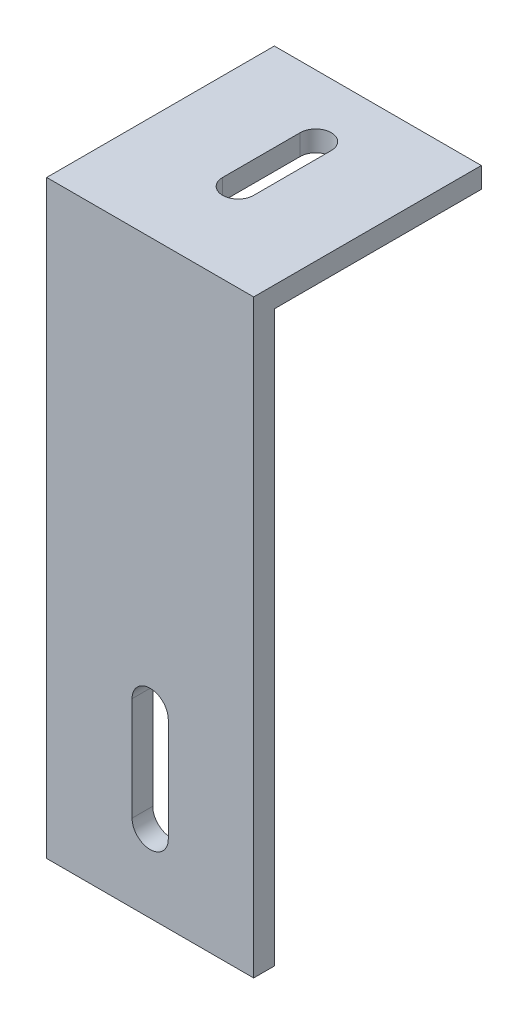
ISO-10303-21;
HEADER;
FILE_DESCRIPTION(('STEP AP214'),'2;1');
FILE_NAME('part.step','',(''),(''),'','','');
FILE_SCHEMA(('AUTOMOTIVE_DESIGN { 1 0 10303 214 1 1 1 1 }'));
ENDSEC;
DATA;
#1=APPLICATION_CONTEXT('core data for automotive mechanical design processes');
#2=APPLICATION_PROTOCOL_DEFINITION('international standard','automotive_design',2000,#1);
#3=PRODUCT_CONTEXT('',#1,'mechanical');
#4=PRODUCT('Part','Part','',(#3));
#5=PRODUCT_RELATED_PRODUCT_CATEGORY('part','',(#4));
#6=PRODUCT_DEFINITION_FORMATION('','',#4);
#7=PRODUCT_DEFINITION_CONTEXT('part definition',#1,'design');
#8=PRODUCT_DEFINITION('design','',#6,#7);
#9=PRODUCT_DEFINITION_SHAPE('','',#8);
#10=(LENGTH_UNIT() NAMED_UNIT(*) SI_UNIT(.MILLI.,.METRE.));
#11=(NAMED_UNIT(*) PLANE_ANGLE_UNIT() SI_UNIT($,.RADIAN.));
#12=(NAMED_UNIT(*) SI_UNIT($,.STERADIAN.) SOLID_ANGLE_UNIT());
#13=UNCERTAINTY_MEASURE_WITH_UNIT(LENGTH_MEASURE(1.E-05),#10,'distance_accuracy_value','');
#14=(GEOMETRIC_REPRESENTATION_CONTEXT(3) GLOBAL_UNCERTAINTY_ASSIGNED_CONTEXT((#13)) GLOBAL_UNIT_ASSIGNED_CONTEXT((#10,
#11,#12)) REPRESENTATION_CONTEXT('',''));
#15=CARTESIAN_POINT('',(0.,0.,0.));
#16=DIRECTION('',(0.,0.,1.));
#17=DIRECTION('',(1.,0.,0.));
#18=AXIS2_PLACEMENT_3D('',#15,#16,#17);
#19=CARTESIAN_POINT('',(40.,0.,-4.00000000000001));
#20=DIRECTION('',(0.,1.,0.));
#21=DIRECTION('',(0.,0.,1.));
#22=AXIS2_PLACEMENT_3D('',#19,#20,#21);
#23=PLANE('',#22);
#24=DIRECTION('',(0.,0.,-1.));
#25=VECTOR('',#24,1.);
#26=CARTESIAN_POINT('',(0.,0.,-4.00000000000001));
#27=LINE('',#26,#25);
#28=CARTESIAN_POINT('',(0.,0.,0.));
#29=VERTEX_POINT('',#28);
#30=CARTESIAN_POINT('',(0.,0.,-4.00000000000001));
#31=VERTEX_POINT('',#30);
#32=EDGE_CURVE('E234',#29,#31,#27,.T.);
#33=ORIENTED_EDGE('',*,*,#32,.T.);
#34=DIRECTION('',(-1.,0.,0.));
#35=VECTOR('',#34,1.);
#36=CARTESIAN_POINT('',(40.,0.,-4.00000000000001));
#37=LINE('',#36,#35);
#38=CARTESIAN_POINT('',(40.,0.,-4.00000000000001));
#39=VERTEX_POINT('',#38);
#40=EDGE_CURVE('E11',#39,#31,#37,.T.);
#41=ORIENTED_EDGE('',*,*,#40,.F.);
#42=DIRECTION('',(0.,0.,-1.));
#43=VECTOR('',#42,1.);
#44=CARTESIAN_POINT('',(40.,0.,-4.00000000000001));
#45=LINE('',#44,#43);
#46=CARTESIAN_POINT('',(40.,0.,0.));
#47=VERTEX_POINT('',#46);
#48=EDGE_CURVE('E235',#47,#39,#45,.T.);
#49=ORIENTED_EDGE('',*,*,#48,.F.);
#50=DIRECTION('',(-1.,0.,0.));
#51=VECTOR('',#50,1.);
#52=CARTESIAN_POINT('',(40.,0.,0.));
#53=LINE('',#52,#51);
#54=EDGE_CURVE('E255',#47,#29,#53,.T.);
#55=ORIENTED_EDGE('',*,*,#54,.T.);
#56=EDGE_LOOP('',(#33,#41,#49,#55));
#57=FACE_BOUND('',#56,.T.);
#58=ADVANCED_FACE('F43',(#57),#23,.F.);
#59=CARTESIAN_POINT('',(40.,110.,-4.));
#60=DIRECTION('',(0.,0.,1.));
#61=DIRECTION('',(0.,-1.,0.));
#62=AXIS2_PLACEMENT_3D('',#59,#60,#61);
#63=PLANE('',#62);
#64=DIRECTION('',(0.,1.,0.));
#65=VECTOR('',#64,1.);
#66=CARTESIAN_POINT('',(16.5,35.,-4.));
#67=LINE('',#66,#65);
#68=CARTESIAN_POINT('',(16.5,15.,-4.));
#69=VERTEX_POINT('',#68);
#70=CARTESIAN_POINT('',(16.5,35.,-4.));
#71=VERTEX_POINT('',#70);
#72=EDGE_CURVE('E166',#69,#71,#67,.T.);
#73=ORIENTED_EDGE('',*,*,#72,.F.);
#74=CARTESIAN_POINT('',(20.,15.,-4.00000000000001));
#75=DIRECTION('',(0.,0.,1.));
#76=DIRECTION('',(0.,-1.,0.));
#77=AXIS2_PLACEMENT_3D('',#74,#75,#76);
#78=CIRCLE('',#77,3.5);
#79=CARTESIAN_POINT('',(23.5,15.,-4.00000000000001));
#80=VERTEX_POINT('',#79);
#81=EDGE_CURVE('E146',#80,#69,#78,.F.);
#82=ORIENTED_EDGE('',*,*,#81,.F.);
#83=DIRECTION('',(0.,-1.,0.));
#84=VECTOR('',#83,1.);
#85=CARTESIAN_POINT('',(23.5,15.,-4.00000000000001));
#86=LINE('',#85,#84);
#87=CARTESIAN_POINT('',(23.5,35.,-4.));
#88=VERTEX_POINT('',#87);
#89=EDGE_CURVE('E156',#88,#80,#86,.T.);
#90=ORIENTED_EDGE('',*,*,#89,.F.);
#91=CARTESIAN_POINT('',(20.,35.,-4.));
#92=DIRECTION('',(0.,0.,1.));
#93=DIRECTION('',(0.,-1.,0.));
#94=AXIS2_PLACEMENT_3D('',#91,#92,#93);
#95=CIRCLE('',#94,3.5);
#96=EDGE_CURVE('E58',#71,#88,#95,.F.);
#97=ORIENTED_EDGE('',*,*,#96,.F.);
#98=EDGE_LOOP('',(#73,#82,#90,#97));
#99=FACE_BOUND('',#98,.T.);
#100=DIRECTION('',(0.,1.,0.));
#101=VECTOR('',#100,1.);
#102=CARTESIAN_POINT('',(0.,110.,-4.));
#103=LINE('',#102,#101);
#104=CARTESIAN_POINT('',(0.,110.,-4.));
#105=VERTEX_POINT('',#104);
#106=EDGE_CURVE('E259',#31,#105,#103,.T.);
#107=ORIENTED_EDGE('',*,*,#106,.T.);
#108=DIRECTION('',(-1.,0.,0.));
#109=VECTOR('',#108,1.);
#110=CARTESIAN_POINT('',(40.,110.,-4.));
#111=LINE('',#110,#109);
#112=CARTESIAN_POINT('',(40.,110.,-4.));
#113=VERTEX_POINT('',#112);
#114=EDGE_CURVE('E51',#113,#105,#111,.T.);
#115=ORIENTED_EDGE('',*,*,#114,.F.);
#116=DIRECTION('',(0.,1.,0.));
#117=VECTOR('',#116,1.);
#118=CARTESIAN_POINT('',(40.,110.,-4.));
#119=LINE('',#118,#117);
#120=EDGE_CURVE('E239',#39,#113,#119,.T.);
#121=ORIENTED_EDGE('',*,*,#120,.F.);
#122=ORIENTED_EDGE('',*,*,#40,.T.);
#123=EDGE_LOOP('',(#107,#115,#121,#122));
#124=FACE_BOUND('',#123,.T.);
#125=ADVANCED_FACE('F163',(#99,#124),#63,.F.);
#126=CARTESIAN_POINT('',(40.,110.,-44.));
#127=DIRECTION('',(0.,1.,0.));
#128=DIRECTION('',(0.,0.,1.));
#129=AXIS2_PLACEMENT_3D('',#126,#127,#128);
#130=PLANE('',#129);
#131=DIRECTION('',(0.,0.,1.));
#132=VECTOR('',#131,1.);
#133=CARTESIAN_POINT('',(23.,110.,-17.));
#134=LINE('',#133,#132);
#135=CARTESIAN_POINT('',(23.,110.,-32.));
#136=VERTEX_POINT('',#135);
#137=CARTESIAN_POINT('',(23.,110.,-17.));
#138=VERTEX_POINT('',#137);
#139=EDGE_CURVE('E194',#136,#138,#134,.T.);
#140=ORIENTED_EDGE('',*,*,#139,.F.);
#141=CARTESIAN_POINT('',(20.,110.,-32.));
#142=DIRECTION('',(0.,1.,0.));
#143=DIRECTION('',(0.,0.,1.));
#144=AXIS2_PLACEMENT_3D('',#141,#142,#143);
#145=CIRCLE('',#144,3.);
#146=CARTESIAN_POINT('',(17.,110.,-32.));
#147=VERTEX_POINT('',#146);
#148=EDGE_CURVE('E198',#147,#136,#145,.F.);
#149=ORIENTED_EDGE('',*,*,#148,.F.);
#150=DIRECTION('',(0.,0.,-1.));
#151=VECTOR('',#150,1.);
#152=CARTESIAN_POINT('',(17.,110.,-32.));
#153=LINE('',#152,#151);
#154=CARTESIAN_POINT('',(17.,110.,-17.));
#155=VERTEX_POINT('',#154);
#156=EDGE_CURVE('E221',#155,#147,#153,.T.);
#157=ORIENTED_EDGE('',*,*,#156,.F.);
#158=CARTESIAN_POINT('',(20.,110.,-17.));
#159=DIRECTION('',(0.,1.,0.));
#160=DIRECTION('',(0.,0.,1.));
#161=AXIS2_PLACEMENT_3D('',#158,#159,#160);
#162=CIRCLE('',#161,3.);
#163=EDGE_CURVE('E160',#138,#155,#162,.F.);
#164=ORIENTED_EDGE('',*,*,#163,.F.);
#165=EDGE_LOOP('',(#140,#149,#157,#164));
#166=FACE_BOUND('',#165,.T.);
#167=DIRECTION('',(0.,0.,-1.));
#168=VECTOR('',#167,1.);
#169=CARTESIAN_POINT('',(0.,110.,-44.));
#170=LINE('',#169,#168);
#171=CARTESIAN_POINT('',(0.,110.,-44.));
#172=VERTEX_POINT('',#171);
#173=EDGE_CURVE('E262',#105,#172,#170,.T.);
#174=ORIENTED_EDGE('',*,*,#173,.T.);
#175=DIRECTION('',(-1.,0.,0.));
#176=VECTOR('',#175,1.);
#177=CARTESIAN_POINT('',(40.,110.,-44.));
#178=LINE('',#177,#176);
#179=CARTESIAN_POINT('',(40.,110.,-44.));
#180=VERTEX_POINT('',#179);
#181=EDGE_CURVE('E284',#180,#172,#178,.T.);
#182=ORIENTED_EDGE('',*,*,#181,.F.);
#183=DIRECTION('',(0.,0.,-1.));
#184=VECTOR('',#183,1.);
#185=CARTESIAN_POINT('',(40.,110.,-44.));
#186=LINE('',#185,#184);
#187=EDGE_CURVE('E243',#113,#180,#186,.T.);
#188=ORIENTED_EDGE('',*,*,#187,.F.);
#189=ORIENTED_EDGE('',*,*,#114,.T.);
#190=EDGE_LOOP('',(#174,#182,#188,#189));
#191=FACE_BOUND('',#190,.T.);
#192=ADVANCED_FACE('F293',(#166,#191),#130,.F.);
#193=CARTESIAN_POINT('',(40.,114.,-44.));
#194=DIRECTION('',(0.,0.,1.));
#195=DIRECTION('',(0.,-1.,0.));
#196=AXIS2_PLACEMENT_3D('',#193,#194,#195);
#197=PLANE('',#196);
#198=DIRECTION('',(0.,1.,0.));
#199=VECTOR('',#198,1.);
#200=CARTESIAN_POINT('',(0.,114.,-44.));
#201=LINE('',#200,#199);
#202=CARTESIAN_POINT('',(0.,114.,-44.));
#203=VERTEX_POINT('',#202);
#204=EDGE_CURVE('E265',#172,#203,#201,.T.);
#205=ORIENTED_EDGE('',*,*,#204,.T.);
#206=DIRECTION('',(-1.,0.,0.));
#207=VECTOR('',#206,1.);
#208=CARTESIAN_POINT('',(40.,114.,-44.));
#209=LINE('',#208,#207);
#210=CARTESIAN_POINT('',(40.,114.,-44.));
#211=VERTEX_POINT('',#210);
#212=EDGE_CURVE('E280',#211,#203,#209,.T.);
#213=ORIENTED_EDGE('',*,*,#212,.F.);
#214=DIRECTION('',(0.,1.,0.));
#215=VECTOR('',#214,1.);
#216=CARTESIAN_POINT('',(40.,114.,-44.));
#217=LINE('',#216,#215);
#218=EDGE_CURVE('E246',#180,#211,#217,.T.);
#219=ORIENTED_EDGE('',*,*,#218,.F.);
#220=ORIENTED_EDGE('',*,*,#181,.T.);
#221=EDGE_LOOP('',(#205,#213,#219,#220));
#222=FACE_BOUND('',#221,.T.);
#223=ADVANCED_FACE('F303',(#222),#197,.F.);
#224=CARTESIAN_POINT('',(40.,114.,0.));
#225=DIRECTION('',(0.,-1.,0.));
#226=DIRECTION('',(0.,0.,-1.));
#227=AXIS2_PLACEMENT_3D('',#224,#225,#226);
#228=PLANE('',#227);
#229=DIRECTION('',(0.,0.,1.));
#230=VECTOR('',#229,1.);
#231=CARTESIAN_POINT('',(17.,114.,-32.));
#232=LINE('',#231,#230);
#233=CARTESIAN_POINT('',(17.,114.,-32.));
#234=VERTEX_POINT('',#233);
#235=CARTESIAN_POINT('',(17.,114.,-17.));
#236=VERTEX_POINT('',#235);
#237=EDGE_CURVE('E205',#234,#236,#232,.T.);
#238=ORIENTED_EDGE('',*,*,#237,.F.);
#239=CARTESIAN_POINT('',(20.,114.,-32.));
#240=DIRECTION('',(0.,1.,0.));
#241=DIRECTION('',(0.,0.,1.));
#242=AXIS2_PLACEMENT_3D('',#239,#240,#241);
#243=CIRCLE('',#242,3.);
#244=CARTESIAN_POINT('',(23.,114.,-32.));
#245=VERTEX_POINT('',#244);
#246=EDGE_CURVE('E202',#245,#234,#243,.T.);
#247=ORIENTED_EDGE('',*,*,#246,.F.);
#248=DIRECTION('',(0.,0.,-1.));
#249=VECTOR('',#248,1.);
#250=CARTESIAN_POINT('',(23.,114.,-17.));
#251=LINE('',#250,#249);
#252=CARTESIAN_POINT('',(23.,114.,-17.));
#253=VERTEX_POINT('',#252);
#254=EDGE_CURVE('E213',#253,#245,#251,.T.);
#255=ORIENTED_EDGE('',*,*,#254,.F.);
#256=CARTESIAN_POINT('',(20.,114.,-17.));
#257=DIRECTION('',(0.,1.,0.));
#258=DIRECTION('',(0.,0.,1.));
#259=AXIS2_PLACEMENT_3D('',#256,#257,#258);
#260=CIRCLE('',#259,3.);
#261=EDGE_CURVE('E209',#236,#253,#260,.T.);
#262=ORIENTED_EDGE('',*,*,#261,.F.);
#263=EDGE_LOOP('',(#238,#247,#255,#262));
#264=FACE_BOUND('',#263,.T.);
#265=DIRECTION('',(0.,0.,1.));
#266=VECTOR('',#265,1.);
#267=CARTESIAN_POINT('',(0.,114.,0.));
#268=LINE('',#267,#266);
#269=CARTESIAN_POINT('',(0.,114.,0.));
#270=VERTEX_POINT('',#269);
#271=EDGE_CURVE('E268',#203,#270,#268,.T.);
#272=ORIENTED_EDGE('',*,*,#271,.T.);
#273=DIRECTION('',(-1.,0.,0.));
#274=VECTOR('',#273,1.);
#275=CARTESIAN_POINT('',(40.,114.,0.));
#276=LINE('',#275,#274);
#277=CARTESIAN_POINT('',(40.,114.,0.));
#278=VERTEX_POINT('',#277);
#279=EDGE_CURVE('E276',#278,#270,#276,.T.);
#280=ORIENTED_EDGE('',*,*,#279,.F.);
#281=DIRECTION('',(0.,0.,1.));
#282=VECTOR('',#281,1.);
#283=CARTESIAN_POINT('',(40.,114.,0.));
#284=LINE('',#283,#282);
#285=EDGE_CURVE('E249',#211,#278,#284,.T.);
#286=ORIENTED_EDGE('',*,*,#285,.F.);
#287=ORIENTED_EDGE('',*,*,#212,.T.);
#288=EDGE_LOOP('',(#272,#280,#286,#287));
#289=FACE_BOUND('',#288,.T.);
#290=ADVANCED_FACE('F307',(#264,#289),#228,.F.);
#291=CARTESIAN_POINT('',(40.,0.,0.));
#292=DIRECTION('',(0.,0.,-1.));
#293=DIRECTION('',(-1.,0.,0.));
#294=AXIS2_PLACEMENT_3D('',#291,#292,#293);
#295=PLANE('',#294);
#296=DIRECTION('',(0.,1.,0.));
#297=VECTOR('',#296,1.);
#298=CARTESIAN_POINT('',(23.5,15.,0.));
#299=LINE('',#298,#297);
#300=CARTESIAN_POINT('',(23.5,15.,0.));
#301=VERTEX_POINT('',#300);
#302=CARTESIAN_POINT('',(23.5,35.,0.));
#303=VERTEX_POINT('',#302);
#304=EDGE_CURVE('E171',#301,#303,#299,.T.);
#305=ORIENTED_EDGE('',*,*,#304,.F.);
#306=CARTESIAN_POINT('',(20.,15.,0.));
#307=DIRECTION('',(0.,0.,1.));
#308=DIRECTION('',(1.,0.,0.));
#309=AXIS2_PLACEMENT_3D('',#306,#307,#308);
#310=CIRCLE('',#309,3.5);
#311=CARTESIAN_POINT('',(16.5,15.,0.));
#312=VERTEX_POINT('',#311);
#313=EDGE_CURVE('E66',#312,#301,#310,.T.);
#314=ORIENTED_EDGE('',*,*,#313,.F.);
#315=DIRECTION('',(0.,-1.,0.));
#316=VECTOR('',#315,1.);
#317=CARTESIAN_POINT('',(16.5,35.,0.));
#318=LINE('',#317,#316);
#319=CARTESIAN_POINT('',(16.5,35.,0.));
#320=VERTEX_POINT('',#319);
#321=EDGE_CURVE('E153',#320,#312,#318,.T.);
#322=ORIENTED_EDGE('',*,*,#321,.F.);
#323=CARTESIAN_POINT('',(20.,35.,0.));
#324=DIRECTION('',(0.,0.,1.));
#325=DIRECTION('',(1.,0.,0.));
#326=AXIS2_PLACEMENT_3D('',#323,#324,#325);
#327=CIRCLE('',#326,3.5);
#328=EDGE_CURVE('E178',#303,#320,#327,.T.);
#329=ORIENTED_EDGE('',*,*,#328,.F.);
#330=EDGE_LOOP('',(#305,#314,#322,#329));
#331=FACE_BOUND('',#330,.T.);
#332=DIRECTION('',(0.,-1.,0.));
#333=VECTOR('',#332,1.);
#334=CARTESIAN_POINT('',(0.,0.,0.));
#335=LINE('',#334,#333);
#336=EDGE_CURVE('E240',#270,#29,#335,.T.);
#337=ORIENTED_EDGE('',*,*,#336,.T.);
#338=ORIENTED_EDGE('',*,*,#54,.F.);
#339=DIRECTION('',(0.,-1.,0.));
#340=VECTOR('',#339,1.);
#341=CARTESIAN_POINT('',(40.,0.,0.));
#342=LINE('',#341,#340);
#343=EDGE_CURVE('E252',#278,#47,#342,.T.);
#344=ORIENTED_EDGE('',*,*,#343,.F.);
#345=ORIENTED_EDGE('',*,*,#279,.T.);
#346=EDGE_LOOP('',(#337,#338,#344,#345));
#347=FACE_BOUND('',#346,.T.);
#348=ADVANCED_FACE('F317',(#331,#347),#295,.F.);
#349=CARTESIAN_POINT('',(40.,0.,0.));
#350=DIRECTION('',(-1.,0.,0.));
#351=DIRECTION('',(0.,0.,1.));
#352=AXIS2_PLACEMENT_3D('',#349,#350,#351);
#353=PLANE('',#352);
#354=ORIENTED_EDGE('',*,*,#48,.T.);
#355=ORIENTED_EDGE('',*,*,#120,.T.);
#356=ORIENTED_EDGE('',*,*,#187,.T.);
#357=ORIENTED_EDGE('',*,*,#218,.T.);
#358=ORIENTED_EDGE('',*,*,#285,.T.);
#359=ORIENTED_EDGE('',*,*,#343,.T.);
#360=EDGE_LOOP('',(#354,#355,#356,#357,#358,#359));
#361=FACE_BOUND('',#360,.T.);
#362=ADVANCED_FACE('F311',(#361),#353,.F.);
#363=CARTESIAN_POINT('',(0.,0.,0.));
#364=DIRECTION('',(-1.,0.,0.));
#365=DIRECTION('',(0.,0.,1.));
#366=AXIS2_PLACEMENT_3D('',#363,#364,#365);
#367=PLANE('',#366);
#368=ORIENTED_EDGE('',*,*,#32,.F.);
#369=ORIENTED_EDGE('',*,*,#336,.F.);
#370=ORIENTED_EDGE('',*,*,#271,.F.);
#371=ORIENTED_EDGE('',*,*,#204,.F.);
#372=ORIENTED_EDGE('',*,*,#173,.F.);
#373=ORIENTED_EDGE('',*,*,#106,.F.);
#374=EDGE_LOOP('',(#368,#369,#370,#371,#372,#373));
#375=FACE_BOUND('',#374,.T.);
#376=ADVANCED_FACE('F298',(#375),#367,.T.);
#377=CARTESIAN_POINT('',(20.,-0.001000000000001,-32.));
#378=DIRECTION('',(0.,1.,0.));
#379=DIRECTION('',(0.,0.,1.));
#380=AXIS2_PLACEMENT_3D('',#377,#378,#379);
#381=CYLINDRICAL_SURFACE('',#380,3.);
#382=ORIENTED_EDGE('',*,*,#148,.T.);
#383=DIRECTION('',(0.,1.,0.));
#384=VECTOR('',#383,1.);
#385=CARTESIAN_POINT('',(23.,-0.001000000000001,-32.));
#386=LINE('',#385,#384);
#387=EDGE_CURVE('E218',#136,#245,#386,.T.);
#388=ORIENTED_EDGE('',*,*,#387,.T.);
#389=ORIENTED_EDGE('',*,*,#246,.T.);
#390=DIRECTION('',(0.,1.,0.));
#391=VECTOR('',#390,1.);
#392=CARTESIAN_POINT('',(17.,-0.001000000000001,-32.));
#393=LINE('',#392,#391);
#394=EDGE_CURVE('E217',#147,#234,#393,.T.);
#395=ORIENTED_EDGE('',*,*,#394,.F.);
#396=EDGE_LOOP('',(#382,#388,#389,#395));
#397=FACE_BOUND('',#396,.T.);
#398=ADVANCED_FACE('F359',(#397),#381,.F.);
#399=CARTESIAN_POINT('',(23.,-0.001000000000001,-17.));
#400=DIRECTION('',(1.,0.,0.));
#401=DIRECTION('',(0.,0.,-1.));
#402=AXIS2_PLACEMENT_3D('',#399,#400,#401);
#403=PLANE('',#402);
#404=ORIENTED_EDGE('',*,*,#139,.T.);
#405=DIRECTION('',(0.,1.,0.));
#406=VECTOR('',#405,1.);
#407=CARTESIAN_POINT('',(23.,-0.001000000000001,-17.));
#408=LINE('',#407,#406);
#409=EDGE_CURVE('E222',#138,#253,#408,.T.);
#410=ORIENTED_EDGE('',*,*,#409,.T.);
#411=ORIENTED_EDGE('',*,*,#254,.T.);
#412=ORIENTED_EDGE('',*,*,#387,.F.);
#413=EDGE_LOOP('',(#404,#410,#411,#412));
#414=FACE_BOUND('',#413,.T.);
#415=ADVANCED_FACE('F364',(#414),#403,.F.);
#416=CARTESIAN_POINT('',(20.,-0.001000000000001,-17.));
#417=DIRECTION('',(0.,1.,0.));
#418=DIRECTION('',(0.,0.,1.));
#419=AXIS2_PLACEMENT_3D('',#416,#417,#418);
#420=CYLINDRICAL_SURFACE('',#419,3.);
#421=ORIENTED_EDGE('',*,*,#163,.T.);
#422=DIRECTION('',(0.,1.,0.));
#423=VECTOR('',#422,1.);
#424=CARTESIAN_POINT('',(17.,-0.001000000000001,-17.));
#425=LINE('',#424,#423);
#426=EDGE_CURVE('E225',#155,#236,#425,.T.);
#427=ORIENTED_EDGE('',*,*,#426,.T.);
#428=ORIENTED_EDGE('',*,*,#261,.T.);
#429=ORIENTED_EDGE('',*,*,#409,.F.);
#430=EDGE_LOOP('',(#421,#427,#428,#429));
#431=FACE_BOUND('',#430,.T.);
#432=ADVANCED_FACE('F377',(#431),#420,.F.);
#433=CARTESIAN_POINT('',(17.,-0.001000000000001,-32.));
#434=DIRECTION('',(-1.,0.,0.));
#435=DIRECTION('',(0.,0.,1.));
#436=AXIS2_PLACEMENT_3D('',#433,#434,#435);
#437=PLANE('',#436);
#438=ORIENTED_EDGE('',*,*,#156,.T.);
#439=ORIENTED_EDGE('',*,*,#394,.T.);
#440=ORIENTED_EDGE('',*,*,#237,.T.);
#441=ORIENTED_EDGE('',*,*,#426,.F.);
#442=EDGE_LOOP('',(#438,#439,#440,#441));
#443=FACE_BOUND('',#442,.T.);
#444=ADVANCED_FACE('F388',(#443),#437,.F.);
#445=CARTESIAN_POINT('',(20.,15.,-44.001));
#446=DIRECTION('',(0.,0.,1.));
#447=DIRECTION('',(1.,0.,0.));
#448=AXIS2_PLACEMENT_3D('',#445,#446,#447);
#449=CYLINDRICAL_SURFACE('',#448,3.5);
#450=ORIENTED_EDGE('',*,*,#81,.T.);
#451=DIRECTION('',(0.,0.,1.));
#452=VECTOR('',#451,1.);
#453=CARTESIAN_POINT('',(16.5,15.,-44.001));
#454=LINE('',#453,#452);
#455=EDGE_CURVE('E161',#69,#312,#454,.T.);
#456=ORIENTED_EDGE('',*,*,#455,.T.);
#457=ORIENTED_EDGE('',*,*,#313,.T.);
#458=DIRECTION('',(0.,0.,1.));
#459=VECTOR('',#458,1.);
#460=CARTESIAN_POINT('',(23.5,15.,-44.001));
#461=LINE('',#460,#459);
#462=EDGE_CURVE('E142',#80,#301,#461,.T.);
#463=ORIENTED_EDGE('',*,*,#462,.F.);
#464=EDGE_LOOP('',(#450,#456,#457,#463));
#465=FACE_BOUND('',#464,.T.);
#466=ADVANCED_FACE('F144',(#465),#449,.F.);
#467=CARTESIAN_POINT('',(16.5,35.,-44.001));
#468=DIRECTION('',(-1.,0.,0.));
#469=DIRECTION('',(0.,0.,1.));
#470=AXIS2_PLACEMENT_3D('',#467,#468,#469);
#471=PLANE('',#470);
#472=ORIENTED_EDGE('',*,*,#72,.T.);
#473=DIRECTION('',(0.,0.,1.));
#474=VECTOR('',#473,1.);
#475=CARTESIAN_POINT('',(16.5,35.,-44.001));
#476=LINE('',#475,#474);
#477=EDGE_CURVE('E187',#71,#320,#476,.T.);
#478=ORIENTED_EDGE('',*,*,#477,.T.);
#479=ORIENTED_EDGE('',*,*,#321,.T.);
#480=ORIENTED_EDGE('',*,*,#455,.F.);
#481=EDGE_LOOP('',(#472,#478,#479,#480));
#482=FACE_BOUND('',#481,.T.);
#483=ADVANCED_FACE('F420',(#482),#471,.F.);
#484=CARTESIAN_POINT('',(20.,35.,-44.001));
#485=DIRECTION('',(0.,0.,1.));
#486=DIRECTION('',(1.,0.,0.));
#487=AXIS2_PLACEMENT_3D('',#484,#485,#486);
#488=CYLINDRICAL_SURFACE('',#487,3.5);
#489=ORIENTED_EDGE('',*,*,#96,.T.);
#490=DIRECTION('',(0.,0.,1.));
#491=VECTOR('',#490,1.);
#492=CARTESIAN_POINT('',(23.5,35.,-44.001));
#493=LINE('',#492,#491);
#494=EDGE_CURVE('E152',#88,#303,#493,.T.);
#495=ORIENTED_EDGE('',*,*,#494,.T.);
#496=ORIENTED_EDGE('',*,*,#328,.T.);
#497=ORIENTED_EDGE('',*,*,#477,.F.);
#498=EDGE_LOOP('',(#489,#495,#496,#497));
#499=FACE_BOUND('',#498,.T.);
#500=ADVANCED_FACE('F430',(#499),#488,.F.);
#501=CARTESIAN_POINT('',(23.5,15.,-44.001));
#502=DIRECTION('',(1.,0.,0.));
#503=DIRECTION('',(0.,1.,0.));
#504=AXIS2_PLACEMENT_3D('',#501,#502,#503);
#505=PLANE('',#504);
#506=ORIENTED_EDGE('',*,*,#89,.T.);
#507=ORIENTED_EDGE('',*,*,#462,.T.);
#508=ORIENTED_EDGE('',*,*,#304,.T.);
#509=ORIENTED_EDGE('',*,*,#494,.F.);
#510=EDGE_LOOP('',(#506,#507,#508,#509));
#511=FACE_BOUND('',#510,.T.);
#512=ADVANCED_FACE('F157',(#511),#505,.F.);
#513=CLOSED_SHELL('',(#58,#125,#192,#223,#290,#348,#362,#376,#398,#415,#432,#444,#466,#483,#500,#512));
#514=MANIFOLD_SOLID_BREP('B2',#513);
#515=ADVANCED_BREP_SHAPE_REPRESENTATION('',(#18,#514),#14);
#516=SHAPE_DEFINITION_REPRESENTATION(#9,#515);
ENDSEC;
END-ISO-10303-21;
